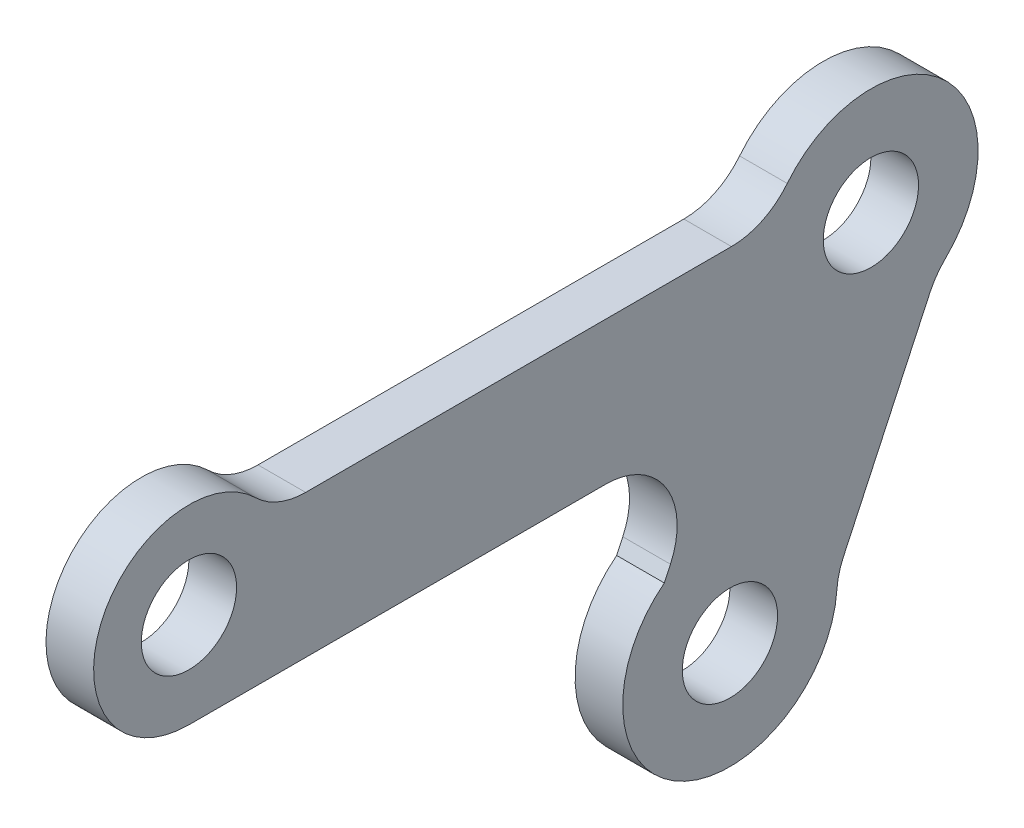
ISO-10303-21;
HEADER;
FILE_DESCRIPTION(('STEP AP214'),'2;1');
FILE_NAME('part.step','',(''),(''),'','','');
FILE_SCHEMA(('AUTOMOTIVE_DESIGN { 1 0 10303 214 1 1 1 1 }'));
ENDSEC;
DATA;
#1=APPLICATION_CONTEXT('core data for automotive mechanical design processes');
#2=APPLICATION_PROTOCOL_DEFINITION('international standard','automotive_design',2000,#1);
#3=PRODUCT_CONTEXT('',#1,'mechanical');
#4=PRODUCT('Part','Part','',(#3));
#5=PRODUCT_RELATED_PRODUCT_CATEGORY('part','',(#4));
#6=PRODUCT_DEFINITION_FORMATION('','',#4);
#7=PRODUCT_DEFINITION_CONTEXT('part definition',#1,'design');
#8=PRODUCT_DEFINITION('design','',#6,#7);
#9=PRODUCT_DEFINITION_SHAPE('','',#8);
#10=(LENGTH_UNIT() NAMED_UNIT(*) SI_UNIT(.MILLI.,.METRE.));
#11=(NAMED_UNIT(*) PLANE_ANGLE_UNIT() SI_UNIT($,.RADIAN.));
#12=(NAMED_UNIT(*) SI_UNIT($,.STERADIAN.) SOLID_ANGLE_UNIT());
#13=UNCERTAINTY_MEASURE_WITH_UNIT(LENGTH_MEASURE(1.E-05),#10,'distance_accuracy_value','');
#14=(GEOMETRIC_REPRESENTATION_CONTEXT(3) GLOBAL_UNCERTAINTY_ASSIGNED_CONTEXT((#13)) GLOBAL_UNIT_ASSIGNED_CONTEXT((#10,
#11,#12)) REPRESENTATION_CONTEXT('',''));
#15=CARTESIAN_POINT('',(0.,0.,0.));
#16=DIRECTION('',(0.,0.,1.));
#17=DIRECTION('',(1.,0.,0.));
#18=AXIS2_PLACEMENT_3D('',#15,#16,#17);
#19=CARTESIAN_POINT('',(0.,-2.,25.));
#20=DIRECTION('',(1.,0.,0.));
#21=DIRECTION('',(0.,0.,-1.));
#22=AXIS2_PLACEMENT_3D('',#19,#20,#21);
#23=PLANE('',#22);
#24=CARTESIAN_POINT('',(0.,-2.,25.));
#25=DIRECTION('',(1.,0.,0.));
#26=DIRECTION('',(0.,0.,-1.));
#27=AXIS2_PLACEMENT_3D('',#24,#25,#26);
#28=CIRCLE('',#27,2.);
#29=CARTESIAN_POINT('',(0.,-2.,23.));
#30=VERTEX_POINT('',#29);
#31=EDGE_CURVE('E438',#30,#30,#28,.T.);
#32=ORIENTED_EDGE('',*,*,#31,.T.);
#33=EDGE_LOOP('',(#32));
#34=FACE_BOUND('',#33,.T.);
#35=CARTESIAN_POINT('',(0.,-1.69047304696279,-3.62523114814653));
#36=DIRECTION('',(1.,0.,0.));
#37=DIRECTION('',(0.,0.,-1.));
#38=AXIS2_PLACEMENT_3D('',#35,#36,#37);
#39=CIRCLE('',#38,2.);
#40=CARTESIAN_POINT('',(0.,-1.69047304696279,-5.62523114814653));
#41=VERTEX_POINT('',#40);
#42=EDGE_CURVE('E434',#41,#41,#39,.T.);
#43=ORIENTED_EDGE('',*,*,#42,.T.);
#44=EDGE_LOOP('',(#43));
#45=FACE_BOUND('',#44,.T.);
#46=CARTESIAN_POINT('',(0.,-14.3787820654759,2.29142451622326));
#47=DIRECTION('',(1.,0.,0.));
#48=DIRECTION('',(0.,0.,-1.));
#49=AXIS2_PLACEMENT_3D('',#46,#47,#48);
#50=CIRCLE('',#49,2.);
#51=CARTESIAN_POINT('',(0.,-14.3787820654759,0.29142451622326));
#52=VERTEX_POINT('',#51);
#53=EDGE_CURVE('E426',#52,#52,#50,.T.);
#54=ORIENTED_EDGE('',*,*,#53,.T.);
#55=EDGE_LOOP('',(#54));
#56=FACE_BOUND('',#55,.T.);
#57=CARTESIAN_POINT('',(0.,-1.69047304696279,-3.62523114814653));
#58=DIRECTION('',(1.,0.,0.));
#59=DIRECTION('',(0.,0.,-1.));
#60=AXIS2_PLACEMENT_3D('',#57,#58,#59);
#61=CIRCLE('',#60,4.50000000000002);
#62=CARTESIAN_POINT('',(0.,-4.92965478602828,-6.74896315670695));
#63=VERTEX_POINT('',#62);
#64=CARTESIAN_POINT('',(0.,1.12381078121489,-0.113848723166622));
#65=VERTEX_POINT('',#64);
#66=EDGE_CURVE('E246',#63,#65,#61,.T.);
#67=ORIENTED_EDGE('',*,*,#66,.F.);
#68=CARTESIAN_POINT('',(0.,-7.08910927873859,-8.83145116241388));
#69=DIRECTION('',(1.,0.,0.));
#70=DIRECTION('',(0.,0.,-1.));
#71=AXIS2_PLACEMENT_3D('',#68,#69,#70);
#72=CIRCLE('',#71,3.);
#73=CARTESIAN_POINT('',(0.,-5.82125449351649,-6.11252780130393));
#74=VERTEX_POINT('',#73);
#75=EDGE_CURVE('E319',#63,#74,#72,.T.);
#76=ORIENTED_EDGE('',*,*,#75,.T.);
#77=DIRECTION('',(0.,-0.90630778703665,0.4226182617407));
#78=VECTOR('',#77,1.);
#79=CARTESIAN_POINT('',(0.,-3.38094609392561,-7.25046229629313));
#80=LINE('',#79,#78);
#81=CARTESIAN_POINT('',(0.,-13.6289467128478,-2.47174112691255));
#82=VERTEX_POINT('',#81);
#83=EDGE_CURVE('E259',#74,#82,#80,.T.);
#84=ORIENTED_EDGE('',*,*,#83,.T.);
#85=CARTESIAN_POINT('',(0.,-14.8968014980699,-5.1906644880225));
#86=DIRECTION('',(1.,0.,0.));
#87=DIRECTION('',(0.,0.,-1.));
#88=AXIS2_PLACEMENT_3D('',#85,#86,#87);
#89=CIRCLE('',#88,3.);
#90=CARTESIAN_POINT('',(0.,-14.6895937250323,-2.19782888632421));
#91=VERTEX_POINT('',#90);
#92=EDGE_CURVE('E313',#82,#91,#89,.T.);
#93=ORIENTED_EDGE('',*,*,#92,.T.);
#94=CARTESIAN_POINT('',(0.,-14.3787820654759,2.29142451622326));
#95=DIRECTION('',(1.,0.,0.));
#96=DIRECTION('',(0.,0.,-1.));
#97=AXIS2_PLACEMENT_3D('',#94,#95,#96);
#98=CIRCLE('',#97,4.50000000000002);
#99=CARTESIAN_POINT('',(0.,-10.8199076508771,5.0454057981339));
#100=VERTEX_POINT('',#99);
#101=EDGE_CURVE('E273',#100,#91,#98,.T.);
#102=ORIENTED_EDGE('',*,*,#101,.F.);
#103=DIRECTION('',(0.,-0.906307787036648,0.422618261740704));
#104=VECTOR('',#103,1.);
#105=CARTESIAN_POINT('',(0.,0.,0.));
#106=LINE('',#105,#104);
#107=CARTESIAN_POINT('',(0.,-10.2678547852221,4.78797931917258));
#108=VERTEX_POINT('',#107);
#109=EDGE_CURVE('E263',#108,#100,#106,.T.);
#110=ORIENTED_EDGE('',*,*,#109,.F.);
#111=CARTESIAN_POINT('',(0.,-9.00000000000001,7.50690268028253));
#112=DIRECTION('',(1.,0.,0.));
#113=DIRECTION('',(0.,0.,-1.));
#114=AXIS2_PLACEMENT_3D('',#111,#112,#113);
#115=CIRCLE('',#114,3.);
#116=CARTESIAN_POINT('',(0.,-6.,7.50690268028252));
#117=VERTEX_POINT('',#116);
#118=EDGE_CURVE('E236',#108,#117,#115,.T.);
#119=ORIENTED_EDGE('',*,*,#118,.T.);
#120=DIRECTION('',(0.,0.,-1.));
#121=VECTOR('',#120,1.);
#122=CARTESIAN_POINT('',(0.,-6.,25.));
#123=LINE('',#122,#121);
#124=CARTESIAN_POINT('',(0.,-5.99999999999999,25.));
#125=VERTEX_POINT('',#124);
#126=EDGE_CURVE('E227',#125,#117,#123,.T.);
#127=ORIENTED_EDGE('',*,*,#126,.F.);
#128=CARTESIAN_POINT('',(0.,-2.,25.));
#129=DIRECTION('',(1.,0.,0.));
#130=DIRECTION('',(0.,0.,-1.));
#131=AXIS2_PLACEMENT_3D('',#128,#129,#130);
#132=CIRCLE('',#131,3.99999999999999);
#133=CARTESIAN_POINT('',(0.,0.857142857142855,22.200583151105));
#134=VERTEX_POINT('',#133);
#135=EDGE_CURVE('E212',#134,#125,#132,.T.);
#136=ORIENTED_EDGE('',*,*,#135,.F.);
#137=CARTESIAN_POINT('',(0.,3.,20.1010205144337));
#138=DIRECTION('',(1.,0.,0.));
#139=DIRECTION('',(0.,0.,-1.));
#140=AXIS2_PLACEMENT_3D('',#137,#138,#139);
#141=CIRCLE('',#140,3.);
#142=CARTESIAN_POINT('',(0.,0.,20.1010205144337));
#143=VERTEX_POINT('',#142);
#144=EDGE_CURVE('E132',#134,#143,#141,.T.);
#145=ORIENTED_EDGE('',*,*,#144,.T.);
#146=DIRECTION('',(0.,0.,-1.));
#147=VECTOR('',#146,1.);
#148=CARTESIAN_POINT('',(0.,0.,25.));
#149=LINE('',#148,#147);
#150=CARTESIAN_POINT('',(0.,0.,2.22707289348664));
#151=VERTEX_POINT('',#150);
#152=EDGE_CURVE('E238',#143,#151,#149,.T.);
#153=ORIENTED_EDGE('',*,*,#152,.T.);
#154=CARTESIAN_POINT('',(0.,3.,2.22707289348664));
#155=DIRECTION('',(1.,0.,0.));
#156=DIRECTION('',(0.,0.,-1.));
#157=AXIS2_PLACEMENT_3D('',#154,#155,#156);
#158=CIRCLE('',#157,3.);
#159=EDGE_CURVE('E330',#151,#65,#158,.T.);
#160=ORIENTED_EDGE('',*,*,#159,.T.);
#161=EDGE_LOOP('',(#67,#76,#84,#93,#102,#110,#119,#127,#136,#145,#153,#160));
#162=FACE_BOUND('',#161,.T.);
#163=ADVANCED_FACE('F123',(#34,#45,#56,#162),#23,.F.);
#164=CARTESIAN_POINT('',(2.,-2.,25.));
#165=DIRECTION('',(1.,0.,0.));
#166=DIRECTION('',(0.,0.,-1.));
#167=AXIS2_PLACEMENT_3D('',#164,#165,#166);
#168=PLANE('',#167);
#169=CARTESIAN_POINT('',(2.,-2.,25.));
#170=DIRECTION('',(1.,0.,0.));
#171=DIRECTION('',(0.,0.,-1.));
#172=AXIS2_PLACEMENT_3D('',#169,#170,#171);
#173=CIRCLE('',#172,2.);
#174=CARTESIAN_POINT('',(2.,-2.,23.));
#175=VERTEX_POINT('',#174);
#176=EDGE_CURVE('E277',#175,#175,#173,.T.);
#177=ORIENTED_EDGE('',*,*,#176,.F.);
#178=EDGE_LOOP('',(#177));
#179=FACE_BOUND('',#178,.T.);
#180=CARTESIAN_POINT('',(2.,-1.69047304696279,-3.62523114814653));
#181=DIRECTION('',(1.,0.,0.));
#182=DIRECTION('',(0.,0.,-1.));
#183=AXIS2_PLACEMENT_3D('',#180,#181,#182);
#184=CIRCLE('',#183,2.);
#185=CARTESIAN_POINT('',(2.,-1.69047304696279,-5.62523114814653));
#186=VERTEX_POINT('',#185);
#187=EDGE_CURVE('E430',#186,#186,#184,.T.);
#188=ORIENTED_EDGE('',*,*,#187,.F.);
#189=EDGE_LOOP('',(#188));
#190=FACE_BOUND('',#189,.T.);
#191=CARTESIAN_POINT('',(2.,-14.3787820654759,2.29142451622326));
#192=DIRECTION('',(1.,0.,0.));
#193=DIRECTION('',(0.,0.,-1.));
#194=AXIS2_PLACEMENT_3D('',#191,#192,#193);
#195=CIRCLE('',#194,2.);
#196=CARTESIAN_POINT('',(2.,-14.3787820654759,0.29142451622326));
#197=VERTEX_POINT('',#196);
#198=EDGE_CURVE('E422',#197,#197,#195,.T.);
#199=ORIENTED_EDGE('',*,*,#198,.F.);
#200=EDGE_LOOP('',(#199));
#201=FACE_BOUND('',#200,.T.);
#202=DIRECTION('',(0.,-0.90630778703665,0.4226182617407));
#203=VECTOR('',#202,1.);
#204=CARTESIAN_POINT('',(2.,-3.38094609392561,-7.25046229629313));
#205=LINE('',#204,#203);
#206=CARTESIAN_POINT('',(2.,-5.82125449351649,-6.11252780130393));
#207=VERTEX_POINT('',#206);
#208=CARTESIAN_POINT('',(2.,-13.6289467128478,-2.47174112691255));
#209=VERTEX_POINT('',#208);
#210=EDGE_CURVE('E258',#207,#209,#205,.T.);
#211=ORIENTED_EDGE('',*,*,#210,.F.);
#212=CARTESIAN_POINT('',(2.,-7.08910927873859,-8.83145116241388));
#213=DIRECTION('',(1.,0.,0.));
#214=DIRECTION('',(0.,0.,-1.));
#215=AXIS2_PLACEMENT_3D('',#212,#213,#214);
#216=CIRCLE('',#215,3.);
#217=CARTESIAN_POINT('',(2.,-4.92965478602828,-6.74896315670695));
#218=VERTEX_POINT('',#217);
#219=EDGE_CURVE('E322',#207,#218,#216,.F.);
#220=ORIENTED_EDGE('',*,*,#219,.T.);
#221=CARTESIAN_POINT('',(2.,-1.69047304696279,-3.62523114814653));
#222=DIRECTION('',(1.,0.,0.));
#223=DIRECTION('',(0.,0.,-1.));
#224=AXIS2_PLACEMENT_3D('',#221,#222,#223);
#225=CIRCLE('',#224,4.50000000000002);
#226=CARTESIAN_POINT('',(2.,1.12381078121489,-0.113848723166622));
#227=VERTEX_POINT('',#226);
#228=EDGE_CURVE('E239',#218,#227,#225,.T.);
#229=ORIENTED_EDGE('',*,*,#228,.T.);
#230=CARTESIAN_POINT('',(2.,3.,2.22707289348664));
#231=DIRECTION('',(1.,0.,0.));
#232=DIRECTION('',(0.,0.,-1.));
#233=AXIS2_PLACEMENT_3D('',#230,#231,#232);
#234=CIRCLE('',#233,3.);
#235=CARTESIAN_POINT('',(2.,0.,2.22707289348664));
#236=VERTEX_POINT('',#235);
#237=EDGE_CURVE('E333',#227,#236,#234,.F.);
#238=ORIENTED_EDGE('',*,*,#237,.T.);
#239=DIRECTION('',(0.,0.,-1.));
#240=VECTOR('',#239,1.);
#241=CARTESIAN_POINT('',(2.,0.,25.));
#242=LINE('',#241,#240);
#243=CARTESIAN_POINT('',(2.,0.,20.1010205144337));
#244=VERTEX_POINT('',#243);
#245=EDGE_CURVE('E222',#244,#236,#242,.T.);
#246=ORIENTED_EDGE('',*,*,#245,.F.);
#247=CARTESIAN_POINT('',(2.,3.,20.1010205144337));
#248=DIRECTION('',(1.,0.,0.));
#249=DIRECTION('',(0.,0.,-1.));
#250=AXIS2_PLACEMENT_3D('',#247,#248,#249);
#251=CIRCLE('',#250,3.);
#252=CARTESIAN_POINT('',(2.,0.857142857142855,22.200583151105));
#253=VERTEX_POINT('',#252);
#254=EDGE_CURVE('E12',#244,#253,#251,.F.);
#255=ORIENTED_EDGE('',*,*,#254,.T.);
#256=CARTESIAN_POINT('',(2.,-2.,25.));
#257=DIRECTION('',(1.,0.,0.));
#258=DIRECTION('',(0.,0.,-1.));
#259=AXIS2_PLACEMENT_3D('',#256,#257,#258);
#260=CIRCLE('',#259,3.99999999999999);
#261=CARTESIAN_POINT('',(2.,-6.,25.));
#262=VERTEX_POINT('',#261);
#263=EDGE_CURVE('E221',#253,#262,#260,.T.);
#264=ORIENTED_EDGE('',*,*,#263,.T.);
#265=DIRECTION('',(0.,0.,-1.));
#266=VECTOR('',#265,1.);
#267=CARTESIAN_POINT('',(2.,-6.,25.));
#268=LINE('',#267,#266);
#269=CARTESIAN_POINT('',(2.,-6.,7.50690268028252));
#270=VERTEX_POINT('',#269);
#271=EDGE_CURVE('E230',#262,#270,#268,.T.);
#272=ORIENTED_EDGE('',*,*,#271,.T.);
#273=CARTESIAN_POINT('',(2.,-9.00000000000001,7.50690268028253));
#274=DIRECTION('',(1.,0.,0.));
#275=DIRECTION('',(0.,0.,-1.));
#276=AXIS2_PLACEMENT_3D('',#273,#274,#275);
#277=CIRCLE('',#276,3.);
#278=CARTESIAN_POINT('',(2.,-10.2678547852221,4.78797931917258));
#279=VERTEX_POINT('',#278);
#280=EDGE_CURVE('E327',#270,#279,#277,.F.);
#281=ORIENTED_EDGE('',*,*,#280,.T.);
#282=DIRECTION('',(0.,-0.906307787036648,0.422618261740704));
#283=VECTOR('',#282,1.);
#284=CARTESIAN_POINT('',(2.,0.,0.));
#285=LINE('',#284,#283);
#286=CARTESIAN_POINT('',(2.,-10.8199076508771,5.0454057981339));
#287=VERTEX_POINT('',#286);
#288=EDGE_CURVE('E255',#279,#287,#285,.T.);
#289=ORIENTED_EDGE('',*,*,#288,.T.);
#290=CARTESIAN_POINT('',(2.,-14.3787820654759,2.29142451622326));
#291=DIRECTION('',(1.,0.,0.));
#292=DIRECTION('',(0.,0.,-1.));
#293=AXIS2_PLACEMENT_3D('',#290,#291,#292);
#294=CIRCLE('',#293,4.50000000000002);
#295=CARTESIAN_POINT('',(2.,-14.6895937250323,-2.19782888632421));
#296=VERTEX_POINT('',#295);
#297=EDGE_CURVE('E266',#287,#296,#294,.T.);
#298=ORIENTED_EDGE('',*,*,#297,.T.);
#299=CARTESIAN_POINT('',(2.,-14.8968014980699,-5.1906644880225));
#300=DIRECTION('',(1.,0.,0.));
#301=DIRECTION('',(0.,0.,-1.));
#302=AXIS2_PLACEMENT_3D('',#299,#300,#301);
#303=CIRCLE('',#302,3.);
#304=EDGE_CURVE('E316',#296,#209,#303,.F.);
#305=ORIENTED_EDGE('',*,*,#304,.T.);
#306=EDGE_LOOP('',(#211,#220,#229,#238,#246,#255,#264,#272,#281,#289,#298,#305));
#307=FACE_BOUND('',#306,.T.);
#308=ADVANCED_FACE('F350',(#179,#190,#201,#307),#168,.T.);
#309=CARTESIAN_POINT('',(2.,-2.,25.));
#310=DIRECTION('',(-1.,0.,0.));
#311=DIRECTION('',(0.,0.,1.));
#312=AXIS2_PLACEMENT_3D('',#309,#310,#311);
#313=CYLINDRICAL_SURFACE('',#312,3.99999999999999);
#314=ORIENTED_EDGE('',*,*,#263,.F.);
#315=DIRECTION('',(-1.,0.,0.));
#316=VECTOR('',#315,1.);
#317=CARTESIAN_POINT('',(2.,0.857142857142856,22.200583151105));
#318=LINE('',#317,#316);
#319=EDGE_CURVE('E217',#253,#134,#318,.T.);
#320=ORIENTED_EDGE('',*,*,#319,.T.);
#321=ORIENTED_EDGE('',*,*,#135,.T.);
#322=DIRECTION('',(-1.,0.,0.));
#323=VECTOR('',#322,1.);
#324=CARTESIAN_POINT('',(2.,-6.,25.));
#325=LINE('',#324,#323);
#326=EDGE_CURVE('E215',#262,#125,#325,.T.);
#327=ORIENTED_EDGE('',*,*,#326,.F.);
#328=EDGE_LOOP('',(#314,#320,#321,#327));
#329=FACE_BOUND('',#328,.T.);
#330=ADVANCED_FACE('F214',(#329),#313,.T.);
#331=CARTESIAN_POINT('',(2.,-14.3787820654759,2.29142451622326));
#332=DIRECTION('',(-1.,0.,0.));
#333=DIRECTION('',(0.,0.,1.));
#334=AXIS2_PLACEMENT_3D('',#331,#332,#333);
#335=CYLINDRICAL_SURFACE('',#334,4.50000000000002);
#336=ORIENTED_EDGE('',*,*,#101,.T.);
#337=DIRECTION('',(-1.,0.,0.));
#338=VECTOR('',#337,1.);
#339=CARTESIAN_POINT('',(2.,-14.6895937250323,-2.19782888632421));
#340=LINE('',#339,#338);
#341=EDGE_CURVE('E287',#91,#296,#340,.F.);
#342=ORIENTED_EDGE('',*,*,#341,.T.);
#343=ORIENTED_EDGE('',*,*,#297,.F.);
#344=DIRECTION('',(-1.,0.,0.));
#345=VECTOR('',#344,1.);
#346=CARTESIAN_POINT('',(2.,-10.8199076508771,5.0454057981339));
#347=LINE('',#346,#345);
#348=EDGE_CURVE('E254',#287,#100,#347,.T.);
#349=ORIENTED_EDGE('',*,*,#348,.T.);
#350=EDGE_LOOP('',(#336,#342,#343,#349));
#351=FACE_BOUND('',#350,.T.);
#352=ADVANCED_FACE('F349',(#351),#335,.T.);
#353=CARTESIAN_POINT('',(2.,-3.38094609392561,-7.25046229629313));
#354=DIRECTION('',(0.,-0.4226182617407,-0.90630778703665));
#355=DIRECTION('',(0.,0.90630778703665,-0.4226182617407));
#356=AXIS2_PLACEMENT_3D('',#353,#354,#355);
#357=PLANE('',#356);
#358=ORIENTED_EDGE('',*,*,#210,.T.);
#359=DIRECTION('',(-1.,0.,0.));
#360=VECTOR('',#359,1.);
#361=CARTESIAN_POINT('',(2.,-13.6289467128478,-2.47174112691255));
#362=LINE('',#361,#360);
#363=EDGE_CURVE('E283',#209,#82,#362,.T.);
#364=ORIENTED_EDGE('',*,*,#363,.T.);
#365=ORIENTED_EDGE('',*,*,#83,.F.);
#366=DIRECTION('',(-1.,0.,0.));
#367=VECTOR('',#366,1.);
#368=CARTESIAN_POINT('',(2.,-5.82125449351649,-6.11252780130393));
#369=LINE('',#368,#367);
#370=EDGE_CURVE('E232',#74,#207,#369,.F.);
#371=ORIENTED_EDGE('',*,*,#370,.T.);
#372=EDGE_LOOP('',(#358,#364,#365,#371));
#373=FACE_BOUND('',#372,.T.);
#374=ADVANCED_FACE('F356',(#373),#357,.T.);
#375=CARTESIAN_POINT('',(2.,0.,0.));
#376=DIRECTION('',(0.,-0.422618261740704,-0.906307787036648));
#377=DIRECTION('',(0.,0.906307787036648,-0.422618261740704));
#378=AXIS2_PLACEMENT_3D('',#375,#376,#377);
#379=PLANE('',#378);
#380=ORIENTED_EDGE('',*,*,#288,.F.);
#381=DIRECTION('',(-1.,0.,0.));
#382=VECTOR('',#381,1.);
#383=CARTESIAN_POINT('',(0.,-10.2678547852221,4.78797931917258));
#384=LINE('',#383,#382);
#385=EDGE_CURVE('E297',#279,#108,#384,.T.);
#386=ORIENTED_EDGE('',*,*,#385,.T.);
#387=ORIENTED_EDGE('',*,*,#109,.T.);
#388=ORIENTED_EDGE('',*,*,#348,.F.);
#389=EDGE_LOOP('',(#380,#386,#387,#388));
#390=FACE_BOUND('',#389,.T.);
#391=ADVANCED_FACE('F359',(#390),#379,.F.);
#392=CARTESIAN_POINT('',(2.,-1.69047304696279,-3.62523114814653));
#393=DIRECTION('',(-1.,0.,0.));
#394=DIRECTION('',(0.,0.,1.));
#395=AXIS2_PLACEMENT_3D('',#392,#393,#394);
#396=CYLINDRICAL_SURFACE('',#395,4.50000000000002);
#397=ORIENTED_EDGE('',*,*,#228,.F.);
#398=DIRECTION('',(-1.,0.,0.));
#399=VECTOR('',#398,1.);
#400=CARTESIAN_POINT('',(2.,-4.92965478602828,-6.74896315670695));
#401=LINE('',#400,#399);
#402=EDGE_CURVE('E293',#218,#63,#401,.T.);
#403=ORIENTED_EDGE('',*,*,#402,.T.);
#404=ORIENTED_EDGE('',*,*,#66,.T.);
#405=DIRECTION('',(-1.,0.,0.));
#406=VECTOR('',#405,1.);
#407=CARTESIAN_POINT('',(2.,1.12381078121489,-0.113848723166622));
#408=LINE('',#407,#406);
#409=EDGE_CURVE('E290',#65,#227,#408,.F.);
#410=ORIENTED_EDGE('',*,*,#409,.T.);
#411=EDGE_LOOP('',(#397,#403,#404,#410));
#412=FACE_BOUND('',#411,.T.);
#413=ADVANCED_FACE('F363',(#412),#396,.T.);
#414=CARTESIAN_POINT('',(2.,0.,25.));
#415=DIRECTION('',(0.,1.,0.));
#416=DIRECTION('',(0.,0.,1.));
#417=AXIS2_PLACEMENT_3D('',#414,#415,#416);
#418=PLANE('',#417);
#419=ORIENTED_EDGE('',*,*,#245,.T.);
#420=DIRECTION('',(-1.,0.,0.));
#421=VECTOR('',#420,1.);
#422=CARTESIAN_POINT('',(2.,0.,2.22707289348664));
#423=LINE('',#422,#421);
#424=EDGE_CURVE('E307',#236,#151,#423,.T.);
#425=ORIENTED_EDGE('',*,*,#424,.T.);
#426=ORIENTED_EDGE('',*,*,#152,.F.);
#427=DIRECTION('',(-1.,0.,0.));
#428=VECTOR('',#427,1.);
#429=CARTESIAN_POINT('',(2.,0.,20.1010205144337));
#430=LINE('',#429,#428);
#431=EDGE_CURVE('E304',#143,#244,#430,.F.);
#432=ORIENTED_EDGE('',*,*,#431,.T.);
#433=EDGE_LOOP('',(#419,#425,#426,#432));
#434=FACE_BOUND('',#433,.T.);
#435=ADVANCED_FACE('F339',(#434),#418,.T.);
#436=CARTESIAN_POINT('',(2.,-6.,25.));
#437=DIRECTION('',(0.,1.,0.));
#438=DIRECTION('',(0.,0.,1.));
#439=AXIS2_PLACEMENT_3D('',#436,#437,#438);
#440=PLANE('',#439);
#441=ORIENTED_EDGE('',*,*,#126,.T.);
#442=DIRECTION('',(-1.,0.,0.));
#443=VECTOR('',#442,1.);
#444=CARTESIAN_POINT('',(2.,-6.,7.50690268028252));
#445=LINE('',#444,#443);
#446=EDGE_CURVE('E301',#117,#270,#445,.F.);
#447=ORIENTED_EDGE('',*,*,#446,.T.);
#448=ORIENTED_EDGE('',*,*,#271,.F.);
#449=ORIENTED_EDGE('',*,*,#326,.T.);
#450=EDGE_LOOP('',(#441,#447,#448,#449));
#451=FACE_BOUND('',#450,.T.);
#452=ADVANCED_FACE('F226',(#451),#440,.F.);
#453=CARTESIAN_POINT('',(2.,-14.3787820654759,2.29142451622326));
#454=DIRECTION('',(-1.,0.,0.));
#455=DIRECTION('',(0.,0.,1.));
#456=AXIS2_PLACEMENT_3D('',#453,#454,#455);
#457=CYLINDRICAL_SURFACE('',#456,2.);
#458=ORIENTED_EDGE('',*,*,#198,.T.);
#459=EDGE_LOOP('',(#458));
#460=FACE_BOUND('',#459,.T.);
#461=ORIENTED_EDGE('',*,*,#53,.F.);
#462=EDGE_LOOP('',(#461));
#463=FACE_BOUND('',#462,.T.);
#464=ADVANCED_FACE('F362',(#460,#463),#457,.F.);
#465=CARTESIAN_POINT('',(2.,-1.69047304696279,-3.62523114814653));
#466=DIRECTION('',(-1.,0.,0.));
#467=DIRECTION('',(0.,0.,1.));
#468=AXIS2_PLACEMENT_3D('',#465,#466,#467);
#469=CYLINDRICAL_SURFACE('',#468,2.);
#470=ORIENTED_EDGE('',*,*,#187,.T.);
#471=EDGE_LOOP('',(#470));
#472=FACE_BOUND('',#471,.T.);
#473=ORIENTED_EDGE('',*,*,#42,.F.);
#474=EDGE_LOOP('',(#473));
#475=FACE_BOUND('',#474,.T.);
#476=ADVANCED_FACE('F453',(#472,#475),#469,.F.);
#477=CARTESIAN_POINT('',(2.,-2.,25.));
#478=DIRECTION('',(-1.,0.,0.));
#479=DIRECTION('',(0.,0.,1.));
#480=AXIS2_PLACEMENT_3D('',#477,#478,#479);
#481=CYLINDRICAL_SURFACE('',#480,2.);
#482=ORIENTED_EDGE('',*,*,#176,.T.);
#483=EDGE_LOOP('',(#482));
#484=FACE_BOUND('',#483,.T.);
#485=ORIENTED_EDGE('',*,*,#31,.F.);
#486=EDGE_LOOP('',(#485));
#487=FACE_BOUND('',#486,.T.);
#488=ADVANCED_FACE('F391',(#484,#487),#481,.F.);
#489=CARTESIAN_POINT('',(2.,-14.8968014980699,-5.1906644880225));
#490=DIRECTION('',(-1.,0.,0.));
#491=DIRECTION('',(0.,0.,1.));
#492=AXIS2_PLACEMENT_3D('',#489,#490,#491);
#493=CYLINDRICAL_SURFACE('',#492,3.);
#494=ORIENTED_EDGE('',*,*,#304,.F.);
#495=ORIENTED_EDGE('',*,*,#341,.F.);
#496=ORIENTED_EDGE('',*,*,#92,.F.);
#497=ORIENTED_EDGE('',*,*,#363,.F.);
#498=EDGE_LOOP('',(#494,#495,#496,#497));
#499=FACE_BOUND('',#498,.T.);
#500=ADVANCED_FACE('F387',(#499),#493,.F.);
#501=CARTESIAN_POINT('',(2.,-7.08910927873859,-8.83145116241388));
#502=DIRECTION('',(-1.,0.,0.));
#503=DIRECTION('',(0.,0.,1.));
#504=AXIS2_PLACEMENT_3D('',#501,#502,#503);
#505=CYLINDRICAL_SURFACE('',#504,3.);
#506=ORIENTED_EDGE('',*,*,#219,.F.);
#507=ORIENTED_EDGE('',*,*,#370,.F.);
#508=ORIENTED_EDGE('',*,*,#75,.F.);
#509=ORIENTED_EDGE('',*,*,#402,.F.);
#510=EDGE_LOOP('',(#506,#507,#508,#509));
#511=FACE_BOUND('',#510,.T.);
#512=ADVANCED_FACE('F390',(#511),#505,.F.);
#513=CARTESIAN_POINT('',(2.,-9.00000000000001,7.50690268028253));
#514=DIRECTION('',(1.,0.,0.));
#515=DIRECTION('',(0.,0.,-1.));
#516=AXIS2_PLACEMENT_3D('',#513,#514,#515);
#517=CYLINDRICAL_SURFACE('',#516,3.);
#518=ORIENTED_EDGE('',*,*,#280,.F.);
#519=ORIENTED_EDGE('',*,*,#446,.F.);
#520=ORIENTED_EDGE('',*,*,#118,.F.);
#521=ORIENTED_EDGE('',*,*,#385,.F.);
#522=EDGE_LOOP('',(#518,#519,#520,#521));
#523=FACE_BOUND('',#522,.T.);
#524=ADVANCED_FACE('F346',(#523),#517,.F.);
#525=CARTESIAN_POINT('',(2.,3.,2.22707289348664));
#526=DIRECTION('',(-1.,0.,0.));
#527=DIRECTION('',(0.,0.,1.));
#528=AXIS2_PLACEMENT_3D('',#525,#526,#527);
#529=CYLINDRICAL_SURFACE('',#528,3.);
#530=ORIENTED_EDGE('',*,*,#237,.F.);
#531=ORIENTED_EDGE('',*,*,#409,.F.);
#532=ORIENTED_EDGE('',*,*,#159,.F.);
#533=ORIENTED_EDGE('',*,*,#424,.F.);
#534=EDGE_LOOP('',(#530,#531,#532,#533));
#535=FACE_BOUND('',#534,.T.);
#536=ADVANCED_FACE('F342',(#535),#529,.F.);
#537=CARTESIAN_POINT('',(2.,3.,20.1010205144337));
#538=DIRECTION('',(-1.,0.,0.));
#539=DIRECTION('',(0.,0.,1.));
#540=AXIS2_PLACEMENT_3D('',#537,#538,#539);
#541=CYLINDRICAL_SURFACE('',#540,3.);
#542=ORIENTED_EDGE('',*,*,#254,.F.);
#543=ORIENTED_EDGE('',*,*,#431,.F.);
#544=ORIENTED_EDGE('',*,*,#144,.F.);
#545=ORIENTED_EDGE('',*,*,#319,.F.);
#546=EDGE_LOOP('',(#542,#543,#544,#545));
#547=FACE_BOUND('',#546,.T.);
#548=ADVANCED_FACE('F125',(#547),#541,.F.);
#549=CLOSED_SHELL('',(#163,#308,#330,#352,#374,#391,#413,#435,#452,#464,#476,#488,#500,#512,
#524,#536,#548));
#550=MANIFOLD_SOLID_BREP('B2',#549);
#551=ADVANCED_BREP_SHAPE_REPRESENTATION('',(#18,#550),#14);
#552=SHAPE_DEFINITION_REPRESENTATION(#9,#551);
ENDSEC;
END-ISO-10303-21;
